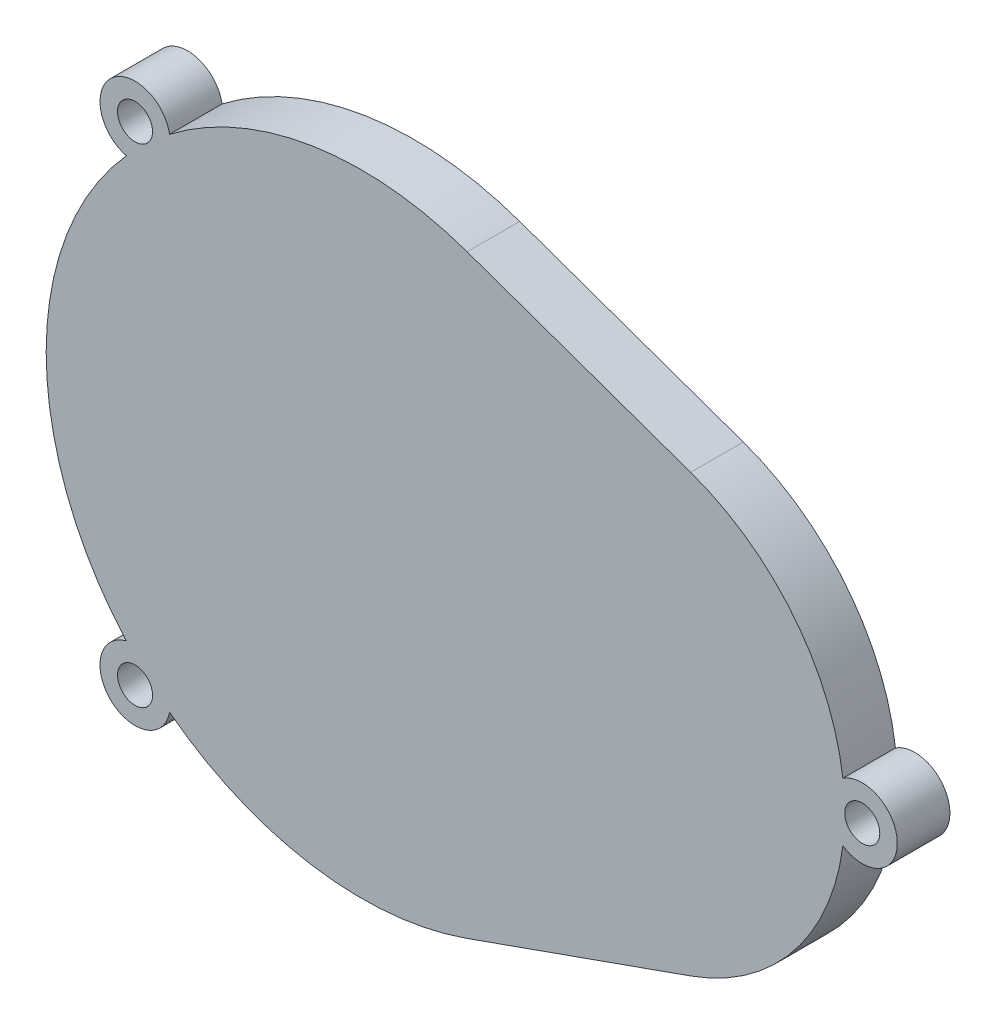
ISO-10303-21;
HEADER;
FILE_DESCRIPTION(('STEP AP214'),'2;1');
FILE_NAME('part.step','',(''),(''),'','','');
FILE_SCHEMA(('AUTOMOTIVE_DESIGN { 1 0 10303 214 1 1 1 1 }'));
ENDSEC;
DATA;
#1=APPLICATION_CONTEXT('core data for automotive mechanical design processes');
#2=APPLICATION_PROTOCOL_DEFINITION('international standard','automotive_design',2000,#1);
#3=PRODUCT_CONTEXT('',#1,'mechanical');
#4=PRODUCT('Part','Part','',(#3));
#5=PRODUCT_RELATED_PRODUCT_CATEGORY('part','',(#4));
#6=PRODUCT_DEFINITION_FORMATION('','',#4);
#7=PRODUCT_DEFINITION_CONTEXT('part definition',#1,'design');
#8=PRODUCT_DEFINITION('design','',#6,#7);
#9=PRODUCT_DEFINITION_SHAPE('','',#8);
#10=(LENGTH_UNIT() NAMED_UNIT(*) SI_UNIT(.MILLI.,.METRE.));
#11=(NAMED_UNIT(*) PLANE_ANGLE_UNIT() SI_UNIT($,.RADIAN.));
#12=(NAMED_UNIT(*) SI_UNIT($,.STERADIAN.) SOLID_ANGLE_UNIT());
#13=UNCERTAINTY_MEASURE_WITH_UNIT(LENGTH_MEASURE(1.E-05),#10,'distance_accuracy_value','');
#14=(GEOMETRIC_REPRESENTATION_CONTEXT(3) GLOBAL_UNCERTAINTY_ASSIGNED_CONTEXT((#13)) GLOBAL_UNIT_ASSIGNED_CONTEXT((#10,
#11,#12)) REPRESENTATION_CONTEXT('',''));
#15=CARTESIAN_POINT('',(0.,0.,0.));
#16=DIRECTION('',(0.,0.,1.));
#17=DIRECTION('',(1.,0.,0.));
#18=AXIS2_PLACEMENT_3D('',#15,#16,#17);
#19=CARTESIAN_POINT('',(2.97882054991763,3.46733164495333,1.5));
#20=DIRECTION('',(0.,0.,1.));
#21=DIRECTION('',(1.,0.,0.));
#22=AXIS2_PLACEMENT_3D('',#19,#20,#21);
#23=PLANE('',#22);
#24=CARTESIAN_POINT('',(-3.48583431135452,-3.49386347690831,1.5));
#25=DIRECTION('',(0.,0.,1.));
#26=DIRECTION('',(1.,0.,0.));
#27=AXIS2_PLACEMENT_3D('',#24,#25,#26);
#28=CIRCLE('',#27,0.500000000000001);
#29=CARTESIAN_POINT('',(-2.98583431135452,-3.49386347690831,1.5));
#30=VERTEX_POINT('',#29);
#31=EDGE_CURVE('E212',#30,#30,#28,.T.);
#32=ORIENTED_EDGE('',*,*,#31,.F.);
#33=EDGE_LOOP('',(#32));
#34=FACE_BOUND('',#33,.T.);
#35=CARTESIAN_POINT('',(2.97882054991763,3.46733164495333,1.5));
#36=DIRECTION('',(0.,0.,1.));
#37=DIRECTION('',(1.,0.,0.));
#38=AXIS2_PLACEMENT_3D('',#35,#36,#37);
#39=CIRCLE('',#38,9.);
#40=CARTESIAN_POINT('',(-2.5017443536611,-3.6715343950884,1.5));
#41=VERTEX_POINT('',#40);
#42=CARTESIAN_POINT('',(5.98717709587864,-5.01499061327134,1.5));
#43=VERTEX_POINT('',#42);
#44=EDGE_CURVE('E161',#41,#43,#39,.T.);
#45=ORIENTED_EDGE('',*,*,#44,.T.);
#46=DIRECTION('',(0.942480250913852,0.334261838440112,0.));
#47=VECTOR('',#46,1.);
#48=CARTESIAN_POINT('',(5.98717709587864,-5.01499061327134,1.5));
#49=LINE('',#48,#47);
#50=CARTESIAN_POINT('',(12.3649486836224,-2.75303801107809,1.5));
#51=VERTEX_POINT('',#50);
#52=EDGE_CURVE('E99',#43,#51,#49,.T.);
#53=ORIENTED_EDGE('',*,*,#52,.T.);
#54=CARTESIAN_POINT('',(10.1588205499176,3.46733164495333,1.5));
#55=DIRECTION('',(0.,0.,1.));
#56=DIRECTION('',(1.,0.,0.));
#57=AXIS2_PLACEMENT_3D('',#54,#55,#56);
#58=CIRCLE('',#57,6.6);
#59=CARTESIAN_POINT('',(16.7060036485092,2.63402889473756,1.5));
#60=VERTEX_POINT('',#59);
#61=EDGE_CURVE('E182',#51,#60,#58,.T.);
#62=ORIENTED_EDGE('',*,*,#61,.T.);
#63=CARTESIAN_POINT('',(17.2588205499176,3.46733164495333,1.5));
#64=DIRECTION('',(0.,0.,1.));
#65=DIRECTION('',(1.,0.,0.));
#66=AXIS2_PLACEMENT_3D('',#63,#64,#65);
#67=CIRCLE('',#66,1.);
#68=CARTESIAN_POINT('',(16.7060036485092,4.3006343951691,1.5));
#69=VERTEX_POINT('',#68);
#70=EDGE_CURVE('E201',#60,#69,#67,.T.);
#71=ORIENTED_EDGE('',*,*,#70,.T.);
#72=CARTESIAN_POINT('',(10.1588205499176,3.46733164495333,1.5));
#73=DIRECTION('',(0.,0.,1.));
#74=DIRECTION('',(1.,0.,0.));
#75=AXIS2_PLACEMENT_3D('',#72,#73,#74);
#76=CIRCLE('',#75,6.6);
#77=CARTESIAN_POINT('',(12.3649486836224,9.68770130098475,1.5));
#78=VERTEX_POINT('',#77);
#79=EDGE_CURVE('E198',#69,#78,#76,.T.);
#80=ORIENTED_EDGE('',*,*,#79,.T.);
#81=DIRECTION('',(-0.942480250913852,0.334261838440111,0.));
#82=VECTOR('',#81,1.);
#83=CARTESIAN_POINT('',(12.3649486836224,9.68770130098475,1.5));
#84=LINE('',#83,#82);
#85=CARTESIAN_POINT('',(5.98717709587864,11.949653903178,1.5));
#86=VERTEX_POINT('',#85);
#87=EDGE_CURVE('E200',#78,#86,#84,.T.);
#88=ORIENTED_EDGE('',*,*,#87,.T.);
#89=CARTESIAN_POINT('',(2.97882054991763,3.46733164495333,1.5));
#90=DIRECTION('',(0.,0.,1.));
#91=DIRECTION('',(1.,0.,0.));
#92=AXIS2_PLACEMENT_3D('',#89,#90,#91);
#93=CIRCLE('',#92,9.);
#94=CARTESIAN_POINT('',(-2.5017443536611,10.6061976849951,1.5));
#95=VERTEX_POINT('',#94);
#96=EDGE_CURVE('E124',#86,#95,#93,.T.);
#97=ORIENTED_EDGE('',*,*,#96,.T.);
#98=CARTESIAN_POINT('',(-3.48583431135452,10.428526766815,1.5));
#99=DIRECTION('',(0.,0.,1.));
#100=DIRECTION('',(1.,0.,0.));
#101=AXIS2_PLACEMENT_3D('',#98,#99,#100);
#102=CIRCLE('',#101,0.999999999999998);
#103=CARTESIAN_POINT('',(-3.73571139006689,9.46024920044561,1.5));
#104=VERTEX_POINT('',#103);
#105=EDGE_CURVE('E118',#95,#104,#102,.T.);
#106=ORIENTED_EDGE('',*,*,#105,.T.);
#107=CARTESIAN_POINT('',(2.97882054991763,3.46733164495333,1.5));
#108=DIRECTION('',(0.,0.,1.));
#109=DIRECTION('',(1.,0.,0.));
#110=AXIS2_PLACEMENT_3D('',#107,#108,#109);
#111=CIRCLE('',#110,9.);
#112=CARTESIAN_POINT('',(-3.7357113900669,-2.52558591053895,1.5));
#113=VERTEX_POINT('',#112);
#114=EDGE_CURVE('E122',#104,#113,#111,.T.);
#115=ORIENTED_EDGE('',*,*,#114,.T.);
#116=CARTESIAN_POINT('',(-3.48583431135452,-3.49386347690831,1.5));
#117=DIRECTION('',(0.,0.,1.));
#118=DIRECTION('',(1.,0.,0.));
#119=AXIS2_PLACEMENT_3D('',#116,#117,#118);
#120=CIRCLE('',#119,0.999999999999997);
#121=EDGE_CURVE('E50',#113,#41,#120,.T.);
#122=ORIENTED_EDGE('',*,*,#121,.T.);
#123=EDGE_LOOP('',(#45,#53,#62,#71,#80,#88,#97,#106,#115,#122));
#124=FACE_BOUND('',#123,.T.);
#125=CARTESIAN_POINT('',(-3.48583431135452,10.428526766815,1.5));
#126=DIRECTION('',(0.,0.,1.));
#127=DIRECTION('',(1.,0.,0.));
#128=AXIS2_PLACEMENT_3D('',#125,#126,#127);
#129=CIRCLE('',#128,0.500000000000001);
#130=CARTESIAN_POINT('',(-2.98583431135452,10.428526766815,1.5));
#131=VERTEX_POINT('',#130);
#132=EDGE_CURVE('E146',#131,#131,#129,.T.);
#133=ORIENTED_EDGE('',*,*,#132,.F.);
#134=EDGE_LOOP('',(#133));
#135=FACE_BOUND('',#134,.T.);
#136=CARTESIAN_POINT('',(17.2588205499176,3.46733164495333,1.5));
#137=DIRECTION('',(0.,0.,1.));
#138=DIRECTION('',(1.,0.,0.));
#139=AXIS2_PLACEMENT_3D('',#136,#137,#138);
#140=CIRCLE('',#139,0.499999999999999);
#141=CARTESIAN_POINT('',(17.7588205499176,3.46733164495333,1.5));
#142=VERTEX_POINT('',#141);
#143=EDGE_CURVE('E218',#142,#142,#140,.T.);
#144=ORIENTED_EDGE('',*,*,#143,.F.);
#145=EDGE_LOOP('',(#144));
#146=FACE_BOUND('',#145,.T.);
#147=ADVANCED_FACE('F33',(#34,#124,#135,#146),#23,.T.);
#148=CARTESIAN_POINT('',(2.97882054991763,3.46733164495333,0.));
#149=DIRECTION('',(0.,0.,1.));
#150=DIRECTION('',(1.,0.,0.));
#151=AXIS2_PLACEMENT_3D('',#148,#149,#150);
#152=PLANE('',#151);
#153=CARTESIAN_POINT('',(2.97882054991763,3.46733164495333,0.));
#154=DIRECTION('',(0.,0.,1.));
#155=DIRECTION('',(1.,0.,0.));
#156=AXIS2_PLACEMENT_3D('',#153,#154,#155);
#157=CIRCLE('',#156,9.);
#158=CARTESIAN_POINT('',(-2.5017443536611,-3.6715343950884,0.));
#159=VERTEX_POINT('',#158);
#160=CARTESIAN_POINT('',(5.98717709587864,-5.01499061327134,0.));
#161=VERTEX_POINT('',#160);
#162=EDGE_CURVE('E142',#159,#161,#157,.T.);
#163=ORIENTED_EDGE('',*,*,#162,.F.);
#164=CARTESIAN_POINT('',(-3.48583431135452,-3.49386347690831,0.));
#165=DIRECTION('',(0.,0.,1.));
#166=DIRECTION('',(1.,0.,0.));
#167=AXIS2_PLACEMENT_3D('',#164,#165,#166);
#168=CIRCLE('',#167,0.999999999999997);
#169=CARTESIAN_POINT('',(-3.7357113900669,-2.52558591053895,0.));
#170=VERTEX_POINT('',#169);
#171=EDGE_CURVE('E91',#170,#159,#168,.T.);
#172=ORIENTED_EDGE('',*,*,#171,.F.);
#173=CARTESIAN_POINT('',(2.97882054991763,3.46733164495333,0.));
#174=DIRECTION('',(0.,0.,1.));
#175=DIRECTION('',(1.,0.,0.));
#176=AXIS2_PLACEMENT_3D('',#173,#174,#175);
#177=CIRCLE('',#176,9.);
#178=CARTESIAN_POINT('',(-3.73571139006689,9.46024920044561,0.));
#179=VERTEX_POINT('',#178);
#180=EDGE_CURVE('E85',#179,#170,#177,.T.);
#181=ORIENTED_EDGE('',*,*,#180,.F.);
#182=CARTESIAN_POINT('',(-3.48583431135452,10.428526766815,0.));
#183=DIRECTION('',(0.,0.,1.));
#184=DIRECTION('',(1.,0.,0.));
#185=AXIS2_PLACEMENT_3D('',#182,#183,#184);
#186=CIRCLE('',#185,0.999999999999998);
#187=CARTESIAN_POINT('',(-2.5017443536611,10.6061976849951,0.));
#188=VERTEX_POINT('',#187);
#189=EDGE_CURVE('E132',#188,#179,#186,.T.);
#190=ORIENTED_EDGE('',*,*,#189,.F.);
#191=CARTESIAN_POINT('',(2.97882054991763,3.46733164495333,0.));
#192=DIRECTION('',(0.,0.,1.));
#193=DIRECTION('',(1.,0.,0.));
#194=AXIS2_PLACEMENT_3D('',#191,#192,#193);
#195=CIRCLE('',#194,9.);
#196=CARTESIAN_POINT('',(5.98717709587864,11.949653903178,0.));
#197=VERTEX_POINT('',#196);
#198=EDGE_CURVE('E156',#197,#188,#195,.T.);
#199=ORIENTED_EDGE('',*,*,#198,.F.);
#200=DIRECTION('',(-0.942480250913852,0.334261838440111,0.));
#201=VECTOR('',#200,1.);
#202=CARTESIAN_POINT('',(12.3649486836224,9.68770130098475,0.));
#203=LINE('',#202,#201);
#204=CARTESIAN_POINT('',(12.3649486836224,9.68770130098475,0.));
#205=VERTEX_POINT('',#204);
#206=EDGE_CURVE('E154',#205,#197,#203,.T.);
#207=ORIENTED_EDGE('',*,*,#206,.F.);
#208=CARTESIAN_POINT('',(10.1588205499176,3.46733164495333,0.));
#209=DIRECTION('',(0.,0.,1.));
#210=DIRECTION('',(1.,0.,0.));
#211=AXIS2_PLACEMENT_3D('',#208,#209,#210);
#212=CIRCLE('',#211,6.6);
#213=CARTESIAN_POINT('',(16.7060036485092,4.3006343951691,0.));
#214=VERTEX_POINT('',#213);
#215=EDGE_CURVE('E152',#214,#205,#212,.T.);
#216=ORIENTED_EDGE('',*,*,#215,.F.);
#217=CARTESIAN_POINT('',(17.2588205499176,3.46733164495333,0.));
#218=DIRECTION('',(0.,0.,1.));
#219=DIRECTION('',(1.,0.,0.));
#220=AXIS2_PLACEMENT_3D('',#217,#218,#219);
#221=CIRCLE('',#220,1.);
#222=CARTESIAN_POINT('',(16.7060036485092,2.63402889473756,0.));
#223=VERTEX_POINT('',#222);
#224=EDGE_CURVE('E150',#223,#214,#221,.T.);
#225=ORIENTED_EDGE('',*,*,#224,.F.);
#226=CARTESIAN_POINT('',(10.1588205499176,3.46733164495333,0.));
#227=DIRECTION('',(0.,0.,1.));
#228=DIRECTION('',(1.,0.,0.));
#229=AXIS2_PLACEMENT_3D('',#226,#227,#228);
#230=CIRCLE('',#229,6.6);
#231=CARTESIAN_POINT('',(12.3649486836224,-2.75303801107809,0.));
#232=VERTEX_POINT('',#231);
#233=EDGE_CURVE('E148',#232,#223,#230,.T.);
#234=ORIENTED_EDGE('',*,*,#233,.F.);
#235=DIRECTION('',(0.942480250913852,0.334261838440112,0.));
#236=VECTOR('',#235,1.);
#237=CARTESIAN_POINT('',(5.98717709587864,-5.01499061327134,0.));
#238=LINE('',#237,#236);
#239=EDGE_CURVE('E145',#161,#232,#238,.T.);
#240=ORIENTED_EDGE('',*,*,#239,.F.);
#241=EDGE_LOOP('',(#163,#172,#181,#190,#199,#207,#216,#225,#234,#240));
#242=FACE_BOUND('',#241,.T.);
#243=CARTESIAN_POINT('',(-3.48583431135452,10.428526766815,0.));
#244=DIRECTION('',(0.,0.,1.));
#245=DIRECTION('',(1.,0.,0.));
#246=AXIS2_PLACEMENT_3D('',#243,#244,#245);
#247=CIRCLE('',#246,0.500000000000001);
#248=CARTESIAN_POINT('',(-2.98583431135452,10.428526766815,0.));
#249=VERTEX_POINT('',#248);
#250=EDGE_CURVE('E209',#249,#249,#247,.T.);
#251=ORIENTED_EDGE('',*,*,#250,.T.);
#252=EDGE_LOOP('',(#251));
#253=FACE_BOUND('',#252,.T.);
#254=CARTESIAN_POINT('',(-3.48583431135452,-3.49386347690831,0.));
#255=DIRECTION('',(0.,0.,1.));
#256=DIRECTION('',(1.,0.,0.));
#257=AXIS2_PLACEMENT_3D('',#254,#255,#256);
#258=CIRCLE('',#257,0.500000000000001);
#259=CARTESIAN_POINT('',(-2.98583431135452,-3.49386347690831,0.));
#260=VERTEX_POINT('',#259);
#261=EDGE_CURVE('E215',#260,#260,#258,.T.);
#262=ORIENTED_EDGE('',*,*,#261,.T.);
#263=EDGE_LOOP('',(#262));
#264=FACE_BOUND('',#263,.T.);
#265=CARTESIAN_POINT('',(17.2588205499176,3.46733164495333,0.));
#266=DIRECTION('',(0.,0.,1.));
#267=DIRECTION('',(1.,0.,0.));
#268=AXIS2_PLACEMENT_3D('',#265,#266,#267);
#269=CIRCLE('',#268,0.499999999999999);
#270=CARTESIAN_POINT('',(17.7588205499176,3.46733164495333,0.));
#271=VERTEX_POINT('',#270);
#272=EDGE_CURVE('E221',#271,#271,#269,.T.);
#273=ORIENTED_EDGE('',*,*,#272,.T.);
#274=EDGE_LOOP('',(#273));
#275=FACE_BOUND('',#274,.T.);
#276=ADVANCED_FACE('F186',(#242,#253,#264,#275),#152,.F.);
#277=CARTESIAN_POINT('',(2.97882054991763,3.46733164495333,1.5));
#278=DIRECTION('',(0.,0.,-1.));
#279=DIRECTION('',(-1.,0.,0.));
#280=AXIS2_PLACEMENT_3D('',#277,#278,#279);
#281=CYLINDRICAL_SURFACE('',#280,9.);
#282=ORIENTED_EDGE('',*,*,#162,.T.);
#283=DIRECTION('',(0.,0.,-1.));
#284=VECTOR('',#283,1.);
#285=CARTESIAN_POINT('',(5.98717709587864,-5.01499061327134,1.5));
#286=LINE('',#285,#284);
#287=EDGE_CURVE('E11',#43,#161,#286,.T.);
#288=ORIENTED_EDGE('',*,*,#287,.F.);
#289=ORIENTED_EDGE('',*,*,#44,.F.);
#290=DIRECTION('',(0.,0.,-1.));
#291=VECTOR('',#290,1.);
#292=CARTESIAN_POINT('',(-2.5017443536611,-3.6715343950884,1.5));
#293=LINE('',#292,#291);
#294=EDGE_CURVE('E138',#41,#159,#293,.T.);
#295=ORIENTED_EDGE('',*,*,#294,.T.);
#296=EDGE_LOOP('',(#282,#288,#289,#295));
#297=FACE_BOUND('',#296,.T.);
#298=ADVANCED_FACE('F35',(#297),#281,.T.);
#299=CARTESIAN_POINT('',(5.98717709587864,-5.01499061327134,1.5));
#300=DIRECTION('',(-0.334261838440112,0.942480250913852,0.));
#301=DIRECTION('',(-0.942480250913852,-0.334261838440112,0.));
#302=AXIS2_PLACEMENT_3D('',#299,#300,#301);
#303=PLANE('',#302);
#304=ORIENTED_EDGE('',*,*,#239,.T.);
#305=DIRECTION('',(0.,0.,-1.));
#306=VECTOR('',#305,1.);
#307=CARTESIAN_POINT('',(12.3649486836224,-2.75303801107809,1.5));
#308=LINE('',#307,#306);
#309=EDGE_CURVE('E42',#51,#232,#308,.T.);
#310=ORIENTED_EDGE('',*,*,#309,.F.);
#311=ORIENTED_EDGE('',*,*,#52,.F.);
#312=ORIENTED_EDGE('',*,*,#287,.T.);
#313=EDGE_LOOP('',(#304,#310,#311,#312));
#314=FACE_BOUND('',#313,.T.);
#315=ADVANCED_FACE('F262',(#314),#303,.F.);
#316=CARTESIAN_POINT('',(10.1588205499176,3.46733164495333,1.5));
#317=DIRECTION('',(0.,0.,-1.));
#318=DIRECTION('',(-1.,0.,0.));
#319=AXIS2_PLACEMENT_3D('',#316,#317,#318);
#320=CYLINDRICAL_SURFACE('',#319,6.6);
#321=ORIENTED_EDGE('',*,*,#233,.T.);
#322=DIRECTION('',(0.,0.,-1.));
#323=VECTOR('',#322,1.);
#324=CARTESIAN_POINT('',(16.7060036485092,2.63402889473756,1.5));
#325=LINE('',#324,#323);
#326=EDGE_CURVE('E174',#60,#223,#325,.T.);
#327=ORIENTED_EDGE('',*,*,#326,.F.);
#328=ORIENTED_EDGE('',*,*,#61,.F.);
#329=ORIENTED_EDGE('',*,*,#309,.T.);
#330=EDGE_LOOP('',(#321,#327,#328,#329));
#331=FACE_BOUND('',#330,.T.);
#332=ADVANCED_FACE('F180',(#331),#320,.T.);
#333=CARTESIAN_POINT('',(17.2588205499176,3.46733164495333,1.5));
#334=DIRECTION('',(0.,0.,-1.));
#335=DIRECTION('',(-1.,0.,0.));
#336=AXIS2_PLACEMENT_3D('',#333,#334,#335);
#337=CYLINDRICAL_SURFACE('',#336,1.);
#338=ORIENTED_EDGE('',*,*,#224,.T.);
#339=DIRECTION('',(0.,0.,-1.));
#340=VECTOR('',#339,1.);
#341=CARTESIAN_POINT('',(16.7060036485092,4.3006343951691,1.5));
#342=LINE('',#341,#340);
#343=EDGE_CURVE('E171',#69,#214,#342,.T.);
#344=ORIENTED_EDGE('',*,*,#343,.F.);
#345=ORIENTED_EDGE('',*,*,#70,.F.);
#346=ORIENTED_EDGE('',*,*,#326,.T.);
#347=EDGE_LOOP('',(#338,#344,#345,#346));
#348=FACE_BOUND('',#347,.T.);
#349=ADVANCED_FACE('F192',(#348),#337,.T.);
#350=CARTESIAN_POINT('',(10.1588205499176,3.46733164495333,1.5));
#351=DIRECTION('',(0.,0.,-1.));
#352=DIRECTION('',(-1.,0.,0.));
#353=AXIS2_PLACEMENT_3D('',#350,#351,#352);
#354=CYLINDRICAL_SURFACE('',#353,6.6);
#355=ORIENTED_EDGE('',*,*,#215,.T.);
#356=DIRECTION('',(0.,0.,-1.));
#357=VECTOR('',#356,1.);
#358=CARTESIAN_POINT('',(12.3649486836224,9.68770130098475,1.5));
#359=LINE('',#358,#357);
#360=EDGE_CURVE('E168',#78,#205,#359,.T.);
#361=ORIENTED_EDGE('',*,*,#360,.F.);
#362=ORIENTED_EDGE('',*,*,#79,.F.);
#363=ORIENTED_EDGE('',*,*,#343,.T.);
#364=EDGE_LOOP('',(#355,#361,#362,#363));
#365=FACE_BOUND('',#364,.T.);
#366=ADVANCED_FACE('F196',(#365),#354,.T.);
#367=CARTESIAN_POINT('',(12.3649486836224,9.68770130098475,1.5));
#368=DIRECTION('',(-0.334261838440111,-0.942480250913852,0.));
#369=DIRECTION('',(0.942480250913852,-0.334261838440111,0.));
#370=AXIS2_PLACEMENT_3D('',#367,#368,#369);
#371=PLANE('',#370);
#372=ORIENTED_EDGE('',*,*,#206,.T.);
#373=DIRECTION('',(0.,0.,-1.));
#374=VECTOR('',#373,1.);
#375=CARTESIAN_POINT('',(5.98717709587864,11.949653903178,1.5));
#376=LINE('',#375,#374);
#377=EDGE_CURVE('E165',#86,#197,#376,.T.);
#378=ORIENTED_EDGE('',*,*,#377,.F.);
#379=ORIENTED_EDGE('',*,*,#87,.F.);
#380=ORIENTED_EDGE('',*,*,#360,.T.);
#381=EDGE_LOOP('',(#372,#378,#379,#380));
#382=FACE_BOUND('',#381,.T.);
#383=ADVANCED_FACE('F252',(#382),#371,.F.);
#384=CARTESIAN_POINT('',(2.97882054991763,3.46733164495333,1.5));
#385=DIRECTION('',(0.,0.,-1.));
#386=DIRECTION('',(-1.,0.,0.));
#387=AXIS2_PLACEMENT_3D('',#384,#385,#386);
#388=CYLINDRICAL_SURFACE('',#387,9.);
#389=ORIENTED_EDGE('',*,*,#198,.T.);
#390=DIRECTION('',(0.,0.,-1.));
#391=VECTOR('',#390,1.);
#392=CARTESIAN_POINT('',(-2.5017443536611,10.6061976849951,1.5));
#393=LINE('',#392,#391);
#394=EDGE_CURVE('E133',#95,#188,#393,.T.);
#395=ORIENTED_EDGE('',*,*,#394,.F.);
#396=ORIENTED_EDGE('',*,*,#96,.F.);
#397=ORIENTED_EDGE('',*,*,#377,.T.);
#398=EDGE_LOOP('',(#389,#395,#396,#397));
#399=FACE_BOUND('',#398,.T.);
#400=ADVANCED_FACE('F249',(#399),#388,.T.);
#401=CARTESIAN_POINT('',(-3.48583431135452,10.428526766815,1.5));
#402=DIRECTION('',(0.,0.,-1.));
#403=DIRECTION('',(-1.,0.,0.));
#404=AXIS2_PLACEMENT_3D('',#401,#402,#403);
#405=CYLINDRICAL_SURFACE('',#404,0.999999999999998);
#406=ORIENTED_EDGE('',*,*,#189,.T.);
#407=DIRECTION('',(0.,0.,-1.));
#408=VECTOR('',#407,1.);
#409=CARTESIAN_POINT('',(-3.73571139006689,9.46024920044561,1.5));
#410=LINE('',#409,#408);
#411=EDGE_CURVE('E129',#104,#179,#410,.T.);
#412=ORIENTED_EDGE('',*,*,#411,.F.);
#413=ORIENTED_EDGE('',*,*,#105,.F.);
#414=ORIENTED_EDGE('',*,*,#394,.T.);
#415=EDGE_LOOP('',(#406,#412,#413,#414));
#416=FACE_BOUND('',#415,.T.);
#417=ADVANCED_FACE('F130',(#416),#405,.T.);
#418=CARTESIAN_POINT('',(2.97882054991763,3.46733164495333,1.5));
#419=DIRECTION('',(0.,0.,-1.));
#420=DIRECTION('',(-1.,0.,0.));
#421=AXIS2_PLACEMENT_3D('',#418,#419,#420);
#422=CYLINDRICAL_SURFACE('',#421,9.);
#423=ORIENTED_EDGE('',*,*,#180,.T.);
#424=DIRECTION('',(0.,0.,-1.));
#425=VECTOR('',#424,1.);
#426=CARTESIAN_POINT('',(-3.7357113900669,-2.52558591053895,1.5));
#427=LINE('',#426,#425);
#428=EDGE_CURVE('E134',#113,#170,#427,.T.);
#429=ORIENTED_EDGE('',*,*,#428,.F.);
#430=ORIENTED_EDGE('',*,*,#114,.F.);
#431=ORIENTED_EDGE('',*,*,#411,.T.);
#432=EDGE_LOOP('',(#423,#429,#430,#431));
#433=FACE_BOUND('',#432,.T.);
#434=ADVANCED_FACE('F136',(#433),#422,.T.);
#435=CARTESIAN_POINT('',(-3.48583431135452,-3.49386347690831,1.5));
#436=DIRECTION('',(0.,0.,-1.));
#437=DIRECTION('',(-1.,0.,0.));
#438=AXIS2_PLACEMENT_3D('',#435,#436,#437);
#439=CYLINDRICAL_SURFACE('',#438,0.999999999999997);
#440=ORIENTED_EDGE('',*,*,#171,.T.);
#441=ORIENTED_EDGE('',*,*,#294,.F.);
#442=ORIENTED_EDGE('',*,*,#121,.F.);
#443=ORIENTED_EDGE('',*,*,#428,.T.);
#444=EDGE_LOOP('',(#440,#441,#442,#443));
#445=FACE_BOUND('',#444,.T.);
#446=ADVANCED_FACE('F242',(#445),#439,.T.);
#447=CARTESIAN_POINT('',(-3.48583431135452,10.428526766815,1.5));
#448=DIRECTION('',(0.,0.,-1.));
#449=DIRECTION('',(-1.,0.,0.));
#450=AXIS2_PLACEMENT_3D('',#447,#448,#449);
#451=CYLINDRICAL_SURFACE('',#450,0.500000000000001);
#452=ORIENTED_EDGE('',*,*,#132,.T.);
#453=EDGE_LOOP('',(#452));
#454=FACE_BOUND('',#453,.T.);
#455=ORIENTED_EDGE('',*,*,#250,.F.);
#456=EDGE_LOOP('',(#455));
#457=FACE_BOUND('',#456,.T.);
#458=ADVANCED_FACE('F239',(#454,#457),#451,.F.);
#459=CARTESIAN_POINT('',(-3.48583431135452,-3.49386347690831,1.5));
#460=DIRECTION('',(0.,0.,-1.));
#461=DIRECTION('',(-1.,0.,0.));
#462=AXIS2_PLACEMENT_3D('',#459,#460,#461);
#463=CYLINDRICAL_SURFACE('',#462,0.500000000000001);
#464=ORIENTED_EDGE('',*,*,#31,.T.);
#465=EDGE_LOOP('',(#464));
#466=FACE_BOUND('',#465,.T.);
#467=ORIENTED_EDGE('',*,*,#261,.F.);
#468=EDGE_LOOP('',(#467));
#469=FACE_BOUND('',#468,.T.);
#470=ADVANCED_FACE('F338',(#466,#469),#463,.F.);
#471=CARTESIAN_POINT('',(17.2588205499176,3.46733164495333,1.5));
#472=DIRECTION('',(0.,0.,-1.));
#473=DIRECTION('',(-1.,0.,0.));
#474=AXIS2_PLACEMENT_3D('',#471,#472,#473);
#475=CYLINDRICAL_SURFACE('',#474,0.499999999999999);
#476=ORIENTED_EDGE('',*,*,#143,.T.);
#477=EDGE_LOOP('',(#476));
#478=FACE_BOUND('',#477,.T.);
#479=ORIENTED_EDGE('',*,*,#272,.F.);
#480=EDGE_LOOP('',(#479));
#481=FACE_BOUND('',#480,.T.);
#482=ADVANCED_FACE('F227',(#478,#481),#475,.F.);
#483=CLOSED_SHELL('',(#147,#276,#298,#315,#332,#349,#366,#383,#400,#417,#434,#446,#458,#470,#482));
#484=MANIFOLD_SOLID_BREP('B2',#483);
#485=ADVANCED_BREP_SHAPE_REPRESENTATION('',(#18,#484),#14);
#486=SHAPE_DEFINITION_REPRESENTATION(#9,#485);
ENDSEC;
END-ISO-10303-21;
